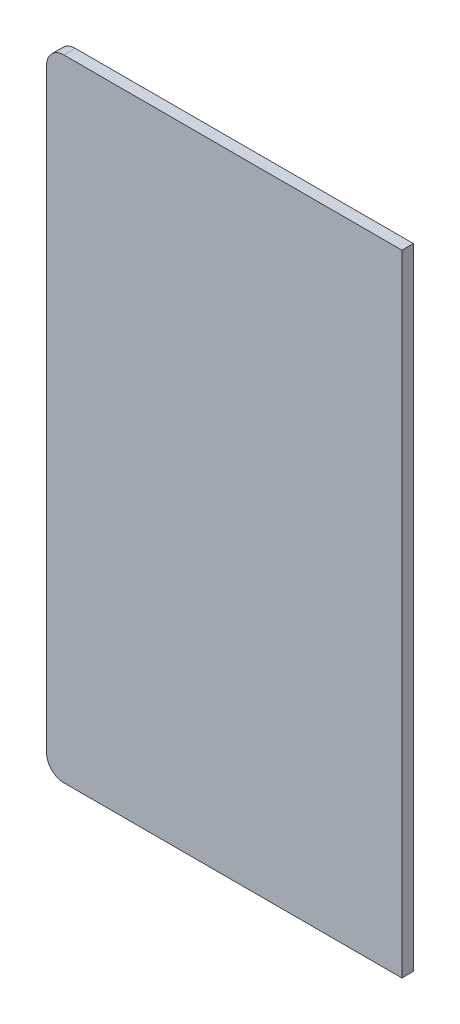
ISO-10303-21;
HEADER;
FILE_DESCRIPTION(('STEP AP214'),'2;1');
FILE_NAME('part.step','',(''),(''),'','','');
FILE_SCHEMA(('AUTOMOTIVE_DESIGN { 1 0 10303 214 1 1 1 1 }'));
ENDSEC;
DATA;
#1=APPLICATION_CONTEXT('core data for automotive mechanical design processes');
#2=APPLICATION_PROTOCOL_DEFINITION('international standard','automotive_design',2000,#1);
#3=PRODUCT_CONTEXT('',#1,'mechanical');
#4=PRODUCT('Part','Part','',(#3));
#5=PRODUCT_RELATED_PRODUCT_CATEGORY('part','',(#4));
#6=PRODUCT_DEFINITION_FORMATION('','',#4);
#7=PRODUCT_DEFINITION_CONTEXT('part definition',#1,'design');
#8=PRODUCT_DEFINITION('design','',#6,#7);
#9=PRODUCT_DEFINITION_SHAPE('','',#8);
#10=(LENGTH_UNIT() NAMED_UNIT(*) SI_UNIT(.MILLI.,.METRE.));
#11=(NAMED_UNIT(*) PLANE_ANGLE_UNIT() SI_UNIT($,.RADIAN.));
#12=(NAMED_UNIT(*) SI_UNIT($,.STERADIAN.) SOLID_ANGLE_UNIT());
#13=UNCERTAINTY_MEASURE_WITH_UNIT(LENGTH_MEASURE(1.E-05),#10,'distance_accuracy_value','');
#14=(GEOMETRIC_REPRESENTATION_CONTEXT(3) GLOBAL_UNCERTAINTY_ASSIGNED_CONTEXT((#13)) GLOBAL_UNIT_ASSIGNED_CONTEXT((#10,
#11,#12)) REPRESENTATION_CONTEXT('',''));
#15=CARTESIAN_POINT('',(0.,0.,0.));
#16=DIRECTION('',(0.,0.,1.));
#17=DIRECTION('',(1.,0.,0.));
#18=AXIS2_PLACEMENT_3D('',#15,#16,#17);
#19=CARTESIAN_POINT('',(850.9,63.5,25.4));
#20=DIRECTION('',(-1.,0.,0.));
#21=DIRECTION('',(0.,0.,1.));
#22=AXIS2_PLACEMENT_3D('',#19,#20,#21);
#23=PLANE('',#22);
#24=DIRECTION('',(0.,1.,0.));
#25=VECTOR('',#24,1.);
#26=CARTESIAN_POINT('',(850.9,63.5,0.));
#27=LINE('',#26,#25);
#28=CARTESIAN_POINT('',(850.9,63.5,0.));
#29=VERTEX_POINT('',#28);
#30=CARTESIAN_POINT('',(850.9,1460.5,0.));
#31=VERTEX_POINT('',#30);
#32=EDGE_CURVE('E117',#29,#31,#27,.T.);
#33=ORIENTED_EDGE('',*,*,#32,.T.);
#34=DIRECTION('',(0.,0.,-1.));
#35=VECTOR('',#34,1.);
#36=CARTESIAN_POINT('',(850.9,1460.5,25.4));
#37=LINE('',#36,#35);
#38=CARTESIAN_POINT('',(850.9,1460.5,25.4));
#39=VERTEX_POINT('',#38);
#40=EDGE_CURVE('E11',#39,#31,#37,.T.);
#41=ORIENTED_EDGE('',*,*,#40,.F.);
#42=DIRECTION('',(0.,1.,0.));
#43=VECTOR('',#42,1.);
#44=CARTESIAN_POINT('',(850.9,63.5,25.4));
#45=LINE('',#44,#43);
#46=CARTESIAN_POINT('',(850.9,63.5,25.4));
#47=VERTEX_POINT('',#46);
#48=EDGE_CURVE('E127',#47,#39,#45,.T.);
#49=ORIENTED_EDGE('',*,*,#48,.F.);
#50=DIRECTION('',(0.,0.,-1.));
#51=VECTOR('',#50,1.);
#52=CARTESIAN_POINT('',(850.9,63.5,25.4));
#53=LINE('',#52,#51);
#54=EDGE_CURVE('E113',#47,#29,#53,.T.);
#55=ORIENTED_EDGE('',*,*,#54,.T.);
#56=EDGE_LOOP('',(#33,#41,#49,#55));
#57=FACE_BOUND('',#56,.T.);
#58=ADVANCED_FACE('F33',(#57),#23,.F.);
#59=CARTESIAN_POINT('',(850.9,1460.5,25.4));
#60=DIRECTION('',(0.,-1.,0.));
#61=DIRECTION('',(0.,0.,-1.));
#62=AXIS2_PLACEMENT_3D('',#59,#60,#61);
#63=PLANE('',#62);
#64=DIRECTION('',(-1.,0.,0.));
#65=VECTOR('',#64,1.);
#66=CARTESIAN_POINT('',(850.9,1460.5,0.));
#67=LINE('',#66,#65);
#68=CARTESIAN_POINT('',(101.600000000001,1460.5,0.));
#69=VERTEX_POINT('',#68);
#70=EDGE_CURVE('E120',#31,#69,#67,.T.);
#71=ORIENTED_EDGE('',*,*,#70,.T.);
#72=DIRECTION('',(0.,0.,-1.));
#73=VECTOR('',#72,1.);
#74=CARTESIAN_POINT('',(101.600000000001,1460.5,25.4));
#75=LINE('',#74,#73);
#76=CARTESIAN_POINT('',(101.600000000001,1460.5,25.4));
#77=VERTEX_POINT('',#76);
#78=EDGE_CURVE('E41',#77,#69,#75,.T.);
#79=ORIENTED_EDGE('',*,*,#78,.F.);
#80=DIRECTION('',(-1.,0.,0.));
#81=VECTOR('',#80,1.);
#82=CARTESIAN_POINT('',(850.9,1460.5,25.4));
#83=LINE('',#82,#81);
#84=EDGE_CURVE('E86',#39,#77,#83,.T.);
#85=ORIENTED_EDGE('',*,*,#84,.F.);
#86=ORIENTED_EDGE('',*,*,#40,.T.);
#87=EDGE_LOOP('',(#71,#79,#85,#86));
#88=FACE_BOUND('',#87,.T.);
#89=ADVANCED_FACE('F151',(#88),#63,.F.);
#90=CARTESIAN_POINT('',(101.6,1422.4,25.4));
#91=DIRECTION('',(0.,0.,-1.));
#92=DIRECTION('',(-1.,0.,0.));
#93=AXIS2_PLACEMENT_3D('',#90,#91,#92);
#94=CYLINDRICAL_SURFACE('',#93,38.1);
#95=CARTESIAN_POINT('',(101.6,1422.4,0.));
#96=DIRECTION('',(0.,0.,1.));
#97=DIRECTION('',(1.,0.,0.));
#98=AXIS2_PLACEMENT_3D('',#95,#96,#97);
#99=CIRCLE('',#98,38.1);
#100=CARTESIAN_POINT('',(63.5,1422.4,0.));
#101=VERTEX_POINT('',#100);
#102=EDGE_CURVE('E122',#69,#101,#99,.T.);
#103=ORIENTED_EDGE('',*,*,#102,.T.);
#104=DIRECTION('',(0.,0.,-1.));
#105=VECTOR('',#104,1.);
#106=CARTESIAN_POINT('',(63.5,1422.4,25.4));
#107=LINE('',#106,#105);
#108=CARTESIAN_POINT('',(63.5,1422.4,25.4));
#109=VERTEX_POINT('',#108);
#110=EDGE_CURVE('E108',#109,#101,#107,.T.);
#111=ORIENTED_EDGE('',*,*,#110,.F.);
#112=CARTESIAN_POINT('',(101.6,1422.4,25.4));
#113=DIRECTION('',(0.,0.,1.));
#114=DIRECTION('',(1.,0.,0.));
#115=AXIS2_PLACEMENT_3D('',#112,#113,#114);
#116=CIRCLE('',#115,38.1);
#117=EDGE_CURVE('E99',#77,#109,#116,.T.);
#118=ORIENTED_EDGE('',*,*,#117,.F.);
#119=ORIENTED_EDGE('',*,*,#78,.T.);
#120=EDGE_LOOP('',(#103,#111,#118,#119));
#121=FACE_BOUND('',#120,.T.);
#122=ADVANCED_FACE('F133',(#121),#94,.T.);
#123=CARTESIAN_POINT('',(63.5,1422.4,25.4));
#124=DIRECTION('',(1.,0.,0.));
#125=DIRECTION('',(0.,0.,-1.));
#126=AXIS2_PLACEMENT_3D('',#123,#124,#125);
#127=PLANE('',#126);
#128=DIRECTION('',(0.,-1.,0.));
#129=VECTOR('',#128,1.);
#130=CARTESIAN_POINT('',(63.5,1422.4,0.));
#131=LINE('',#130,#129);
#132=CARTESIAN_POINT('',(63.5,101.600000000001,0.));
#133=VERTEX_POINT('',#132);
#134=EDGE_CURVE('E107',#101,#133,#131,.T.);
#135=ORIENTED_EDGE('',*,*,#134,.T.);
#136=DIRECTION('',(0.,0.,-1.));
#137=VECTOR('',#136,1.);
#138=CARTESIAN_POINT('',(63.5,101.600000000001,25.4));
#139=LINE('',#138,#137);
#140=CARTESIAN_POINT('',(63.5,101.600000000001,25.4));
#141=VERTEX_POINT('',#140);
#142=EDGE_CURVE('E104',#141,#133,#139,.T.);
#143=ORIENTED_EDGE('',*,*,#142,.F.);
#144=DIRECTION('',(0.,-1.,0.));
#145=VECTOR('',#144,1.);
#146=CARTESIAN_POINT('',(63.5,1422.4,25.4));
#147=LINE('',#146,#145);
#148=EDGE_CURVE('E93',#109,#141,#147,.T.);
#149=ORIENTED_EDGE('',*,*,#148,.F.);
#150=ORIENTED_EDGE('',*,*,#110,.T.);
#151=EDGE_LOOP('',(#135,#143,#149,#150));
#152=FACE_BOUND('',#151,.T.);
#153=ADVANCED_FACE('F105',(#152),#127,.F.);
#154=CARTESIAN_POINT('',(101.6,101.6,25.4));
#155=DIRECTION('',(0.,0.,-1.));
#156=DIRECTION('',(-1.,0.,0.));
#157=AXIS2_PLACEMENT_3D('',#154,#155,#156);
#158=CYLINDRICAL_SURFACE('',#157,38.1);
#159=CARTESIAN_POINT('',(101.6,101.6,0.));
#160=DIRECTION('',(0.,0.,1.));
#161=DIRECTION('',(1.,0.,0.));
#162=AXIS2_PLACEMENT_3D('',#159,#160,#161);
#163=CIRCLE('',#162,38.1);
#164=CARTESIAN_POINT('',(101.6,63.5,0.));
#165=VERTEX_POINT('',#164);
#166=EDGE_CURVE('E72',#133,#165,#163,.T.);
#167=ORIENTED_EDGE('',*,*,#166,.T.);
#168=DIRECTION('',(0.,0.,-1.));
#169=VECTOR('',#168,1.);
#170=CARTESIAN_POINT('',(101.6,63.5,25.4));
#171=LINE('',#170,#169);
#172=CARTESIAN_POINT('',(101.6,63.5,25.4));
#173=VERTEX_POINT('',#172);
#174=EDGE_CURVE('E109',#173,#165,#171,.T.);
#175=ORIENTED_EDGE('',*,*,#174,.F.);
#176=CARTESIAN_POINT('',(101.6,101.6,25.4));
#177=DIRECTION('',(0.,0.,1.));
#178=DIRECTION('',(1.,0.,0.));
#179=AXIS2_PLACEMENT_3D('',#176,#177,#178);
#180=CIRCLE('',#179,38.1);
#181=EDGE_CURVE('E97',#141,#173,#180,.T.);
#182=ORIENTED_EDGE('',*,*,#181,.F.);
#183=ORIENTED_EDGE('',*,*,#142,.T.);
#184=EDGE_LOOP('',(#167,#175,#182,#183));
#185=FACE_BOUND('',#184,.T.);
#186=ADVANCED_FACE('F111',(#185),#158,.T.);
#187=CARTESIAN_POINT('',(101.6,63.5,25.4));
#188=DIRECTION('',(0.,1.,0.));
#189=DIRECTION('',(0.,0.,1.));
#190=AXIS2_PLACEMENT_3D('',#187,#188,#189);
#191=PLANE('',#190);
#192=DIRECTION('',(1.,0.,0.));
#193=VECTOR('',#192,1.);
#194=CARTESIAN_POINT('',(101.6,63.5,0.));
#195=LINE('',#194,#193);
#196=EDGE_CURVE('E78',#165,#29,#195,.T.);
#197=ORIENTED_EDGE('',*,*,#196,.T.);
#198=ORIENTED_EDGE('',*,*,#54,.F.);
#199=DIRECTION('',(1.,0.,0.));
#200=VECTOR('',#199,1.);
#201=CARTESIAN_POINT('',(101.6,63.5,25.4));
#202=LINE('',#201,#200);
#203=EDGE_CURVE('E49',#173,#47,#202,.T.);
#204=ORIENTED_EDGE('',*,*,#203,.F.);
#205=ORIENTED_EDGE('',*,*,#174,.T.);
#206=EDGE_LOOP('',(#197,#198,#204,#205));
#207=FACE_BOUND('',#206,.T.);
#208=ADVANCED_FACE('F140',(#207),#191,.F.);
#209=CARTESIAN_POINT('',(101.6,1422.4,25.4));
#210=DIRECTION('',(0.,0.,1.));
#211=DIRECTION('',(1.,0.,0.));
#212=AXIS2_PLACEMENT_3D('',#209,#210,#211);
#213=PLANE('',#212);
#214=ORIENTED_EDGE('',*,*,#48,.T.);
#215=ORIENTED_EDGE('',*,*,#84,.T.);
#216=ORIENTED_EDGE('',*,*,#117,.T.);
#217=ORIENTED_EDGE('',*,*,#148,.T.);
#218=ORIENTED_EDGE('',*,*,#181,.T.);
#219=ORIENTED_EDGE('',*,*,#203,.T.);
#220=EDGE_LOOP('',(#214,#215,#216,#217,#218,#219));
#221=FACE_BOUND('',#220,.T.);
#222=ADVANCED_FACE('F95',(#221),#213,.T.);
#223=CARTESIAN_POINT('',(101.6,1422.4,0.));
#224=DIRECTION('',(0.,0.,1.));
#225=DIRECTION('',(1.,0.,0.));
#226=AXIS2_PLACEMENT_3D('',#223,#224,#225);
#227=PLANE('',#226);
#228=ORIENTED_EDGE('',*,*,#32,.F.);
#229=ORIENTED_EDGE('',*,*,#196,.F.);
#230=ORIENTED_EDGE('',*,*,#166,.F.);
#231=ORIENTED_EDGE('',*,*,#134,.F.);
#232=ORIENTED_EDGE('',*,*,#102,.F.);
#233=ORIENTED_EDGE('',*,*,#70,.F.);
#234=EDGE_LOOP('',(#228,#229,#230,#231,#232,#233));
#235=FACE_BOUND('',#234,.T.);
#236=ADVANCED_FACE('F136',(#235),#227,.F.);
#237=CLOSED_SHELL('',(#58,#89,#122,#153,#186,#208,#222,#236));
#238=MANIFOLD_SOLID_BREP('B2',#237);
#239=ADVANCED_BREP_SHAPE_REPRESENTATION('',(#18,#238),#14);
#240=SHAPE_DEFINITION_REPRESENTATION(#9,#239);
ENDSEC;
END-ISO-10303-21;
